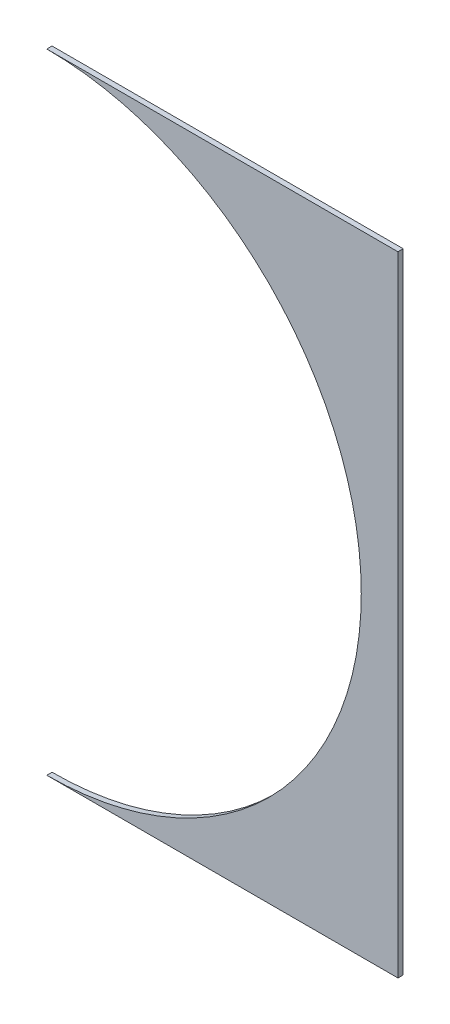
ISO-10303-21;
HEADER;
FILE_DESCRIPTION(('STEP AP214'),'2;1');
FILE_NAME('part.step','',(''),(''),'','','');
FILE_SCHEMA(('AUTOMOTIVE_DESIGN { 1 0 10303 214 1 1 1 1 }'));
ENDSEC;
DATA;
#1=APPLICATION_CONTEXT('core data for automotive mechanical design processes');
#2=APPLICATION_PROTOCOL_DEFINITION('international standard','automotive_design',2000,#1);
#3=PRODUCT_CONTEXT('',#1,'mechanical');
#4=PRODUCT('Part','Part','',(#3));
#5=PRODUCT_RELATED_PRODUCT_CATEGORY('part','',(#4));
#6=PRODUCT_DEFINITION_FORMATION('','',#4);
#7=PRODUCT_DEFINITION_CONTEXT('part definition',#1,'design');
#8=PRODUCT_DEFINITION('design','',#6,#7);
#9=PRODUCT_DEFINITION_SHAPE('','',#8);
#10=(LENGTH_UNIT() NAMED_UNIT(*) SI_UNIT(.MILLI.,.METRE.));
#11=(NAMED_UNIT(*) PLANE_ANGLE_UNIT() SI_UNIT($,.RADIAN.));
#12=(NAMED_UNIT(*) SI_UNIT($,.STERADIAN.) SOLID_ANGLE_UNIT());
#13=UNCERTAINTY_MEASURE_WITH_UNIT(LENGTH_MEASURE(1.E-05),#10,'distance_accuracy_value','');
#14=(GEOMETRIC_REPRESENTATION_CONTEXT(3) GLOBAL_UNCERTAINTY_ASSIGNED_CONTEXT((#13)) GLOBAL_UNIT_ASSIGNED_CONTEXT((#10,
#11,#12)) REPRESENTATION_CONTEXT('',''));
#15=CARTESIAN_POINT('',(0.,0.,0.));
#16=DIRECTION('',(0.,0.,1.));
#17=DIRECTION('',(1.,0.,0.));
#18=AXIS2_PLACEMENT_3D('',#15,#16,#17);
#19=CARTESIAN_POINT('',(0.,190.5,3.175));
#20=DIRECTION('',(0.,0.,-1.));
#21=DIRECTION('',(-1.,0.,0.));
#22=AXIS2_PLACEMENT_3D('',#19,#20,#21);
#23=CYLINDRICAL_SURFACE('',#22,190.5);
#24=CARTESIAN_POINT('',(0.,190.5,0.));
#25=DIRECTION('',(0.,0.,1.));
#26=DIRECTION('',(1.,0.,0.));
#27=AXIS2_PLACEMENT_3D('',#24,#25,#26);
#28=CIRCLE('',#27,190.5);
#29=CARTESIAN_POINT('',(0.,0.,0.));
#30=VERTEX_POINT('',#29);
#31=CARTESIAN_POINT('',(0.,381.,0.));
#32=VERTEX_POINT('',#31);
#33=EDGE_CURVE('E99',#30,#32,#28,.T.);
#34=ORIENTED_EDGE('',*,*,#33,.F.);
#35=DIRECTION('',(0.,0.,-1.));
#36=VECTOR('',#35,1.);
#37=CARTESIAN_POINT('',(0.,0.,3.175));
#38=LINE('',#37,#36);
#39=CARTESIAN_POINT('',(0.,0.,3.175));
#40=VERTEX_POINT('',#39);
#41=EDGE_CURVE('E11',#40,#30,#38,.T.);
#42=ORIENTED_EDGE('',*,*,#41,.F.);
#43=CARTESIAN_POINT('',(0.,190.5,3.175));
#44=DIRECTION('',(0.,0.,1.));
#45=DIRECTION('',(1.,0.,0.));
#46=AXIS2_PLACEMENT_3D('',#43,#44,#45);
#47=CIRCLE('',#46,190.5);
#48=CARTESIAN_POINT('',(0.,381.,3.175));
#49=VERTEX_POINT('',#48);
#50=EDGE_CURVE('E84',#40,#49,#47,.T.);
#51=ORIENTED_EDGE('',*,*,#50,.T.);
#52=DIRECTION('',(0.,0.,-1.));
#53=VECTOR('',#52,1.);
#54=CARTESIAN_POINT('',(0.,381.,3.175));
#55=LINE('',#54,#53);
#56=EDGE_CURVE('E52',#49,#32,#55,.T.);
#57=ORIENTED_EDGE('',*,*,#56,.T.);
#58=EDGE_LOOP('',(#34,#42,#51,#57));
#59=FACE_BOUND('',#58,.T.);
#60=ADVANCED_FACE('F36',(#59),#23,.F.);
#61=CARTESIAN_POINT('',(0.,0.,3.175));
#62=DIRECTION('',(0.,1.,0.));
#63=DIRECTION('',(0.,0.,1.));
#64=AXIS2_PLACEMENT_3D('',#61,#62,#63);
#65=PLANE('',#64);
#66=DIRECTION('',(1.,0.,0.));
#67=VECTOR('',#66,1.);
#68=CARTESIAN_POINT('',(0.,0.,0.));
#69=LINE('',#68,#67);
#70=CARTESIAN_POINT('',(212.725,0.,0.));
#71=VERTEX_POINT('',#70);
#72=EDGE_CURVE('E90',#30,#71,#69,.T.);
#73=ORIENTED_EDGE('',*,*,#72,.T.);
#74=DIRECTION('',(0.,0.,-1.));
#75=VECTOR('',#74,1.);
#76=CARTESIAN_POINT('',(212.725,0.,3.175));
#77=LINE('',#76,#75);
#78=CARTESIAN_POINT('',(212.725,0.,3.175));
#79=VERTEX_POINT('',#78);
#80=EDGE_CURVE('E44',#79,#71,#77,.T.);
#81=ORIENTED_EDGE('',*,*,#80,.F.);
#82=DIRECTION('',(1.,0.,0.));
#83=VECTOR('',#82,1.);
#84=CARTESIAN_POINT('',(0.,0.,3.175));
#85=LINE('',#84,#83);
#86=EDGE_CURVE('E78',#40,#79,#85,.T.);
#87=ORIENTED_EDGE('',*,*,#86,.F.);
#88=ORIENTED_EDGE('',*,*,#41,.T.);
#89=EDGE_LOOP('',(#73,#81,#87,#88));
#90=FACE_BOUND('',#89,.T.);
#91=ADVANCED_FACE('F88',(#90),#65,.F.);
#92=CARTESIAN_POINT('',(212.725,0.,3.175));
#93=DIRECTION('',(-1.,0.,0.));
#94=DIRECTION('',(0.,0.,1.));
#95=AXIS2_PLACEMENT_3D('',#92,#93,#94);
#96=PLANE('',#95);
#97=DIRECTION('',(0.,1.,0.));
#98=VECTOR('',#97,1.);
#99=CARTESIAN_POINT('',(212.725,0.,0.));
#100=LINE('',#99,#98);
#101=CARTESIAN_POINT('',(212.725,381.,0.));
#102=VERTEX_POINT('',#101);
#103=EDGE_CURVE('E102',#71,#102,#100,.T.);
#104=ORIENTED_EDGE('',*,*,#103,.T.);
#105=DIRECTION('',(0.,0.,-1.));
#106=VECTOR('',#105,1.);
#107=CARTESIAN_POINT('',(212.725,381.,3.175));
#108=LINE('',#107,#106);
#109=CARTESIAN_POINT('',(212.725,381.,3.175));
#110=VERTEX_POINT('',#109);
#111=EDGE_CURVE('E66',#110,#102,#108,.T.);
#112=ORIENTED_EDGE('',*,*,#111,.F.);
#113=DIRECTION('',(0.,1.,0.));
#114=VECTOR('',#113,1.);
#115=CARTESIAN_POINT('',(212.725,0.,3.175));
#116=LINE('',#115,#114);
#117=EDGE_CURVE('E83',#79,#110,#116,.T.);
#118=ORIENTED_EDGE('',*,*,#117,.F.);
#119=ORIENTED_EDGE('',*,*,#80,.T.);
#120=EDGE_LOOP('',(#104,#112,#118,#119));
#121=FACE_BOUND('',#120,.T.);
#122=ADVANCED_FACE('F93',(#121),#96,.F.);
#123=CARTESIAN_POINT('',(0.,381.,3.175));
#124=DIRECTION('',(0.,1.,0.));
#125=DIRECTION('',(0.,0.,1.));
#126=AXIS2_PLACEMENT_3D('',#123,#124,#125);
#127=PLANE('',#126);
#128=DIRECTION('',(1.,0.,0.));
#129=VECTOR('',#128,1.);
#130=CARTESIAN_POINT('',(0.,381.,0.));
#131=LINE('',#130,#129);
#132=EDGE_CURVE('E104',#32,#102,#131,.T.);
#133=ORIENTED_EDGE('',*,*,#132,.F.);
#134=ORIENTED_EDGE('',*,*,#56,.F.);
#135=DIRECTION('',(1.,0.,0.));
#136=VECTOR('',#135,1.);
#137=CARTESIAN_POINT('',(0.,381.,3.175));
#138=LINE('',#137,#136);
#139=EDGE_CURVE('E94',#49,#110,#138,.T.);
#140=ORIENTED_EDGE('',*,*,#139,.T.);
#141=ORIENTED_EDGE('',*,*,#111,.T.);
#142=EDGE_LOOP('',(#133,#134,#140,#141));
#143=FACE_BOUND('',#142,.T.);
#144=ADVANCED_FACE('F109',(#143),#127,.T.);
#145=CARTESIAN_POINT('',(0.,0.,3.175));
#146=DIRECTION('',(0.,0.,1.));
#147=DIRECTION('',(1.,0.,0.));
#148=AXIS2_PLACEMENT_3D('',#145,#146,#147);
#149=PLANE('',#148);
#150=ORIENTED_EDGE('',*,*,#50,.F.);
#151=ORIENTED_EDGE('',*,*,#86,.T.);
#152=ORIENTED_EDGE('',*,*,#117,.T.);
#153=ORIENTED_EDGE('',*,*,#139,.F.);
#154=EDGE_LOOP('',(#150,#151,#152,#153));
#155=FACE_BOUND('',#154,.T.);
#156=ADVANCED_FACE('F80',(#155),#149,.T.);
#157=CARTESIAN_POINT('',(0.,0.,0.));
#158=DIRECTION('',(0.,0.,1.));
#159=DIRECTION('',(1.,0.,0.));
#160=AXIS2_PLACEMENT_3D('',#157,#158,#159);
#161=PLANE('',#160);
#162=ORIENTED_EDGE('',*,*,#33,.T.);
#163=ORIENTED_EDGE('',*,*,#132,.T.);
#164=ORIENTED_EDGE('',*,*,#103,.F.);
#165=ORIENTED_EDGE('',*,*,#72,.F.);
#166=EDGE_LOOP('',(#162,#163,#164,#165));
#167=FACE_BOUND('',#166,.T.);
#168=ADVANCED_FACE('F116',(#167),#161,.F.);
#169=CLOSED_SHELL('',(#60,#91,#122,#144,#156,#168));
#170=MANIFOLD_SOLID_BREP('B2',#169);
#171=ADVANCED_BREP_SHAPE_REPRESENTATION('',(#18,#170),#14);
#172=SHAPE_DEFINITION_REPRESENTATION(#9,#171);
ENDSEC;
END-ISO-10303-21;
